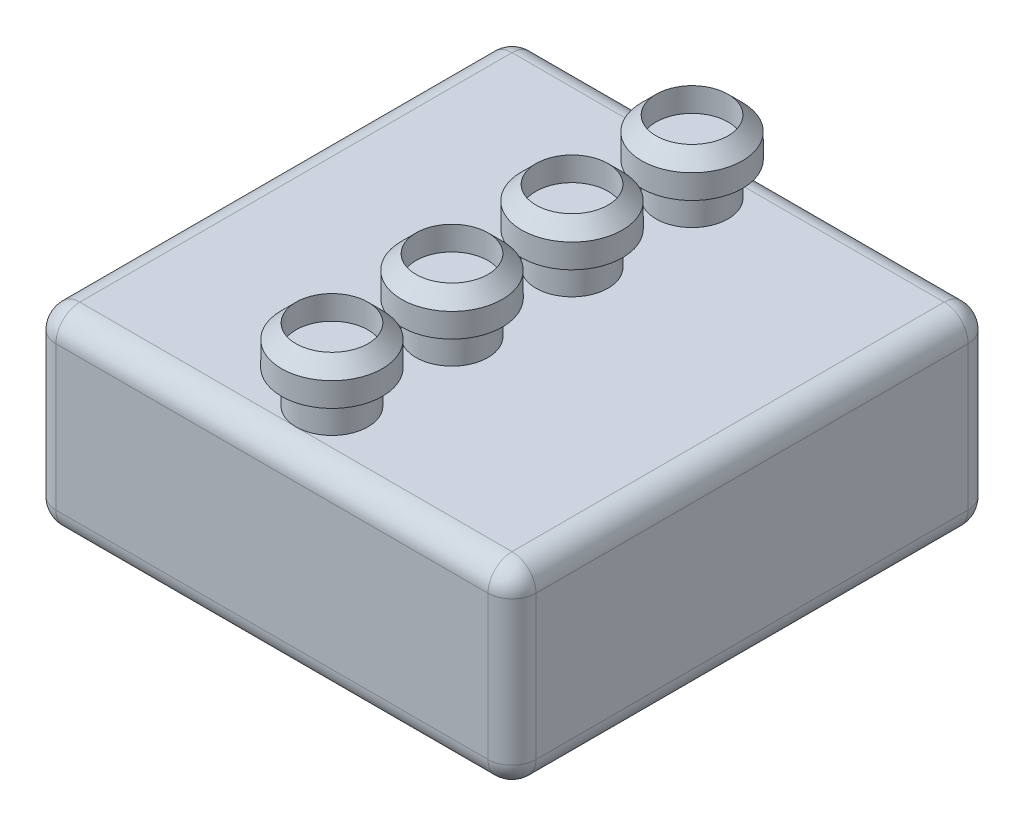
ISO-10303-21;
HEADER;
FILE_DESCRIPTION(('STEP AP214'),'2;1');
FILE_NAME('part.step','',(''),(''),'','','');
FILE_SCHEMA(('AUTOMOTIVE_DESIGN { 1 0 10303 214 1 1 1 1 }'));
ENDSEC;
DATA;
#1=APPLICATION_CONTEXT('core data for automotive mechanical design processes');
#2=APPLICATION_PROTOCOL_DEFINITION('international standard','automotive_design',2000,#1);
#3=PRODUCT_CONTEXT('',#1,'mechanical');
#4=PRODUCT('Part','Part','',(#3));
#5=PRODUCT_RELATED_PRODUCT_CATEGORY('part','',(#4));
#6=PRODUCT_DEFINITION_FORMATION('','',#4);
#7=PRODUCT_DEFINITION_CONTEXT('part definition',#1,'design');
#8=PRODUCT_DEFINITION('design','',#6,#7);
#9=PRODUCT_DEFINITION_SHAPE('','',#8);
#10=(LENGTH_UNIT() NAMED_UNIT(*) SI_UNIT(.MILLI.,.METRE.));
#11=(NAMED_UNIT(*) PLANE_ANGLE_UNIT() SI_UNIT($,.RADIAN.));
#12=(NAMED_UNIT(*) SI_UNIT($,.STERADIAN.) SOLID_ANGLE_UNIT());
#13=UNCERTAINTY_MEASURE_WITH_UNIT(LENGTH_MEASURE(1.E-05),#10,'distance_accuracy_value','');
#14=(GEOMETRIC_REPRESENTATION_CONTEXT(3) GLOBAL_UNCERTAINTY_ASSIGNED_CONTEXT((#13)) GLOBAL_UNIT_ASSIGNED_CONTEXT((#10,
#11,#12)) REPRESENTATION_CONTEXT('',''));
#15=CARTESIAN_POINT('',(0.,0.,0.));
#16=DIRECTION('',(0.,0.,1.));
#17=DIRECTION('',(1.,0.,0.));
#18=AXIS2_PLACEMENT_3D('',#15,#16,#17);
#19=CARTESIAN_POINT('',(-1.28634337458216E-13,50.,-37.5));
#20=DIRECTION('',(0.,-1.,0.));
#21=DIRECTION('',(0.,0.,-1.));
#22=AXIS2_PLACEMENT_3D('',#19,#20,#21);
#23=CYLINDRICAL_SURFACE('',#22,7.5);
#24=CARTESIAN_POINT('',(-1.28634337458216E-13,46.,-37.5));
#25=DIRECTION('',(0.,1.,0.));
#26=DIRECTION('',(0.,0.,1.));
#27=AXIS2_PLACEMENT_3D('',#24,#25,#26);
#28=CIRCLE('',#27,7.5);
#29=CARTESIAN_POINT('',(-1.28634337458216E-13,46.,-30.));
#30=VERTEX_POINT('',#29);
#31=EDGE_CURVE('E158',#30,#30,#28,.F.);
#32=ORIENTED_EDGE('',*,*,#31,.T.);
#33=EDGE_LOOP('',(#32));
#34=FACE_BOUND('',#33,.T.);
#35=CARTESIAN_POINT('',(-1.28634337458216E-13,40.,-37.5));
#36=DIRECTION('',(0.,-1.,0.));
#37=DIRECTION('',(0.,0.,-1.));
#38=AXIS2_PLACEMENT_3D('',#35,#36,#37);
#39=CIRCLE('',#38,7.5);
#40=CARTESIAN_POINT('',(-1.28634337458216E-13,40.,-45.));
#41=VERTEX_POINT('',#40);
#42=EDGE_CURVE('E140',#41,#41,#39,.F.);
#43=ORIENTED_EDGE('',*,*,#42,.T.);
#44=EDGE_LOOP('',(#43));
#45=FACE_BOUND('',#44,.T.);
#46=ADVANCED_FACE('F41',(#34,#45),#23,.T.);
#47=CARTESIAN_POINT('',(0.,50.,-12.5));
#48=DIRECTION('',(0.,-1.,0.));
#49=DIRECTION('',(0.,0.,-1.));
#50=AXIS2_PLACEMENT_3D('',#47,#48,#49);
#51=CYLINDRICAL_SURFACE('',#50,7.5);
#52=CARTESIAN_POINT('',(0.,46.,-12.5));
#53=DIRECTION('',(0.,1.,0.));
#54=DIRECTION('',(0.,0.,1.));
#55=AXIS2_PLACEMENT_3D('',#52,#53,#54);
#56=CIRCLE('',#55,7.5);
#57=CARTESIAN_POINT('',(0.,46.,-5.));
#58=VERTEX_POINT('',#57);
#59=EDGE_CURVE('E172',#58,#58,#56,.F.);
#60=ORIENTED_EDGE('',*,*,#59,.T.);
#61=EDGE_LOOP('',(#60));
#62=FACE_BOUND('',#61,.T.);
#63=CARTESIAN_POINT('',(0.,40.,-12.5));
#64=DIRECTION('',(0.,-1.,0.));
#65=DIRECTION('',(0.,0.,-1.));
#66=AXIS2_PLACEMENT_3D('',#63,#64,#65);
#67=CIRCLE('',#66,7.5);
#68=CARTESIAN_POINT('',(0.,40.,-20.));
#69=VERTEX_POINT('',#68);
#70=EDGE_CURVE('E153',#69,#69,#67,.F.);
#71=ORIENTED_EDGE('',*,*,#70,.T.);
#72=EDGE_LOOP('',(#71));
#73=FACE_BOUND('',#72,.T.);
#74=ADVANCED_FACE('F453',(#62,#73),#51,.T.);
#75=CARTESIAN_POINT('',(0.,50.,12.5));
#76=DIRECTION('',(0.,-1.,0.));
#77=DIRECTION('',(0.,0.,-1.));
#78=AXIS2_PLACEMENT_3D('',#75,#76,#77);
#79=CYLINDRICAL_SURFACE('',#78,7.5);
#80=CARTESIAN_POINT('',(0.,46.,12.5));
#81=DIRECTION('',(0.,1.,0.));
#82=DIRECTION('',(0.,0.,1.));
#83=AXIS2_PLACEMENT_3D('',#80,#81,#82);
#84=CIRCLE('',#83,7.5);
#85=CARTESIAN_POINT('',(0.,46.,20.));
#86=VERTEX_POINT('',#85);
#87=EDGE_CURVE('E180',#86,#86,#84,.F.);
#88=ORIENTED_EDGE('',*,*,#87,.T.);
#89=EDGE_LOOP('',(#88));
#90=FACE_BOUND('',#89,.T.);
#91=CARTESIAN_POINT('',(0.,40.,12.5));
#92=DIRECTION('',(0.,-1.,0.));
#93=DIRECTION('',(0.,0.,-1.));
#94=AXIS2_PLACEMENT_3D('',#91,#92,#93);
#95=CIRCLE('',#94,7.5);
#96=CARTESIAN_POINT('',(0.,40.,5.));
#97=VERTEX_POINT('',#96);
#98=EDGE_CURVE('E161',#97,#97,#95,.F.);
#99=ORIENTED_EDGE('',*,*,#98,.T.);
#100=EDGE_LOOP('',(#99));
#101=FACE_BOUND('',#100,.T.);
#102=ADVANCED_FACE('F433',(#90,#101),#79,.T.);
#103=CARTESIAN_POINT('',(1.28634337458216E-13,50.,37.5));
#104=DIRECTION('',(0.,-1.,0.));
#105=DIRECTION('',(0.,0.,-1.));
#106=AXIS2_PLACEMENT_3D('',#103,#104,#105);
#107=CYLINDRICAL_SURFACE('',#106,7.5);
#108=CARTESIAN_POINT('',(1.28634337458216E-13,46.,37.5));
#109=DIRECTION('',(0.,1.,0.));
#110=DIRECTION('',(0.,0.,1.));
#111=AXIS2_PLACEMENT_3D('',#108,#109,#110);
#112=CIRCLE('',#111,7.5);
#113=CARTESIAN_POINT('',(1.28634337458216E-13,46.,45.));
#114=VERTEX_POINT('',#113);
#115=EDGE_CURVE('E188',#114,#114,#112,.F.);
#116=ORIENTED_EDGE('',*,*,#115,.T.);
#117=EDGE_LOOP('',(#116));
#118=FACE_BOUND('',#117,.T.);
#119=CARTESIAN_POINT('',(1.28634337458216E-13,40.,37.5));
#120=DIRECTION('',(0.,-1.,0.));
#121=DIRECTION('',(0.,0.,-1.));
#122=AXIS2_PLACEMENT_3D('',#119,#120,#121);
#123=CIRCLE('',#122,7.5);
#124=CARTESIAN_POINT('',(1.28634337458216E-13,40.,45.));
#125=VERTEX_POINT('',#124);
#126=EDGE_CURVE('E426',#125,#125,#123,.F.);
#127=ORIENTED_EDGE('',*,*,#126,.T.);
#128=EDGE_LOOP('',(#127));
#129=FACE_BOUND('',#128,.T.);
#130=ADVANCED_FACE('F479',(#118,#129),#107,.T.);
#131=CARTESIAN_POINT('',(50.,40.,50.));
#132=DIRECTION('',(-1.,0.,0.));
#133=DIRECTION('',(0.,0.,1.));
#134=AXIS2_PLACEMENT_3D('',#131,#132,#133);
#135=PLANE('',#134);
#136=DIRECTION('',(0.,0.,-1.));
#137=VECTOR('',#136,1.);
#138=CARTESIAN_POINT('',(50.,35.,50.));
#139=LINE('',#138,#137);
#140=CARTESIAN_POINT('',(50.,35.,-45.));
#141=VERTEX_POINT('',#140);
#142=CARTESIAN_POINT('',(50.,35.,45.));
#143=VERTEX_POINT('',#142);
#144=EDGE_CURVE('E51',#141,#143,#139,.F.);
#145=ORIENTED_EDGE('',*,*,#144,.T.);
#146=DIRECTION('',(0.,-1.,0.));
#147=VECTOR('',#146,1.);
#148=CARTESIAN_POINT('',(50.,40.,45.));
#149=LINE('',#148,#147);
#150=CARTESIAN_POINT('',(50.,5.,45.));
#151=VERTEX_POINT('',#150);
#152=EDGE_CURVE('E11',#143,#151,#149,.T.);
#153=ORIENTED_EDGE('',*,*,#152,.T.);
#154=DIRECTION('',(0.,0.,-1.));
#155=VECTOR('',#154,1.);
#156=CARTESIAN_POINT('',(50.,5.,-50.));
#157=LINE('',#156,#155);
#158=CARTESIAN_POINT('',(50.,5.,-45.));
#159=VERTEX_POINT('',#158);
#160=EDGE_CURVE('E290',#151,#159,#157,.T.);
#161=ORIENTED_EDGE('',*,*,#160,.T.);
#162=DIRECTION('',(0.,-1.,0.));
#163=VECTOR('',#162,1.);
#164=CARTESIAN_POINT('',(50.,40.,-45.));
#165=LINE('',#164,#163);
#166=EDGE_CURVE('E62',#159,#141,#165,.F.);
#167=ORIENTED_EDGE('',*,*,#166,.T.);
#168=EDGE_LOOP('',(#145,#153,#161,#167));
#169=FACE_BOUND('',#168,.T.);
#170=ADVANCED_FACE('F487',(#169),#135,.F.);
#171=CARTESIAN_POINT('',(-50.,40.,-50.));
#172=DIRECTION('',(0.,0.,1.));
#173=DIRECTION('',(1.,0.,0.));
#174=AXIS2_PLACEMENT_3D('',#171,#172,#173);
#175=PLANE('',#174);
#176=DIRECTION('',(0.,-1.,0.));
#177=VECTOR('',#176,1.);
#178=CARTESIAN_POINT('',(-45.,40.,-50.));
#179=LINE('',#178,#177);
#180=CARTESIAN_POINT('',(-45.,5.,-50.));
#181=VERTEX_POINT('',#180);
#182=CARTESIAN_POINT('',(-45.,35.,-50.));
#183=VERTEX_POINT('',#182);
#184=EDGE_CURVE('E283',#181,#183,#179,.F.);
#185=ORIENTED_EDGE('',*,*,#184,.T.);
#186=DIRECTION('',(-1.,0.,0.));
#187=VECTOR('',#186,1.);
#188=CARTESIAN_POINT('',(-50.,35.,-50.));
#189=LINE('',#188,#187);
#190=CARTESIAN_POINT('',(45.,35.,-50.));
#191=VERTEX_POINT('',#190);
#192=EDGE_CURVE('E286',#183,#191,#189,.F.);
#193=ORIENTED_EDGE('',*,*,#192,.T.);
#194=DIRECTION('',(0.,-1.,0.));
#195=VECTOR('',#194,1.);
#196=CARTESIAN_POINT('',(45.,40.,-50.));
#197=LINE('',#196,#195);
#198=CARTESIAN_POINT('',(45.,5.,-50.));
#199=VERTEX_POINT('',#198);
#200=EDGE_CURVE('E277',#191,#199,#197,.T.);
#201=ORIENTED_EDGE('',*,*,#200,.T.);
#202=DIRECTION('',(-1.,0.,0.));
#203=VECTOR('',#202,1.);
#204=CARTESIAN_POINT('',(-50.,5.,-50.));
#205=LINE('',#204,#203);
#206=EDGE_CURVE('E280',#199,#181,#205,.T.);
#207=ORIENTED_EDGE('',*,*,#206,.T.);
#208=EDGE_LOOP('',(#185,#193,#201,#207));
#209=FACE_BOUND('',#208,.T.);
#210=ADVANCED_FACE('F492',(#209),#175,.F.);
#211=CARTESIAN_POINT('',(-50.,40.,50.));
#212=DIRECTION('',(1.,0.,0.));
#213=DIRECTION('',(0.,0.,-1.));
#214=AXIS2_PLACEMENT_3D('',#211,#212,#213);
#215=PLANE('',#214);
#216=DIRECTION('',(0.,-1.,0.));
#217=VECTOR('',#216,1.);
#218=CARTESIAN_POINT('',(-50.,40.,45.));
#219=LINE('',#218,#217);
#220=CARTESIAN_POINT('',(-50.,5.,45.));
#221=VERTEX_POINT('',#220);
#222=CARTESIAN_POINT('',(-50.,35.,45.));
#223=VERTEX_POINT('',#222);
#224=EDGE_CURVE('E270',#221,#223,#219,.F.);
#225=ORIENTED_EDGE('',*,*,#224,.T.);
#226=DIRECTION('',(0.,0.,1.));
#227=VECTOR('',#226,1.);
#228=CARTESIAN_POINT('',(-50.,35.,50.));
#229=LINE('',#228,#227);
#230=CARTESIAN_POINT('',(-50.,35.,-45.));
#231=VERTEX_POINT('',#230);
#232=EDGE_CURVE('E273',#223,#231,#229,.F.);
#233=ORIENTED_EDGE('',*,*,#232,.T.);
#234=DIRECTION('',(0.,-1.,0.));
#235=VECTOR('',#234,1.);
#236=CARTESIAN_POINT('',(-50.,40.,-45.));
#237=LINE('',#236,#235);
#238=CARTESIAN_POINT('',(-50.,5.,-45.));
#239=VERTEX_POINT('',#238);
#240=EDGE_CURVE('E264',#231,#239,#237,.T.);
#241=ORIENTED_EDGE('',*,*,#240,.T.);
#242=DIRECTION('',(0.,0.,1.));
#243=VECTOR('',#242,1.);
#244=CARTESIAN_POINT('',(-50.,5.,50.));
#245=LINE('',#244,#243);
#246=EDGE_CURVE('E267',#239,#221,#245,.T.);
#247=ORIENTED_EDGE('',*,*,#246,.T.);
#248=EDGE_LOOP('',(#225,#233,#241,#247));
#249=FACE_BOUND('',#248,.T.);
#250=ADVANCED_FACE('F447',(#249),#215,.F.);
#251=CARTESIAN_POINT('',(-50.,40.,50.));
#252=DIRECTION('',(0.,0.,-1.));
#253=DIRECTION('',(-1.,0.,0.));
#254=AXIS2_PLACEMENT_3D('',#251,#252,#253);
#255=PLANE('',#254);
#256=DIRECTION('',(1.,0.,0.));
#257=VECTOR('',#256,1.);
#258=CARTESIAN_POINT('',(-50.,35.,50.));
#259=LINE('',#258,#257);
#260=CARTESIAN_POINT('',(45.,35.,50.));
#261=VERTEX_POINT('',#260);
#262=CARTESIAN_POINT('',(-45.,35.,50.));
#263=VERTEX_POINT('',#262);
#264=EDGE_CURVE('E244',#261,#263,#259,.F.);
#265=ORIENTED_EDGE('',*,*,#264,.T.);
#266=DIRECTION('',(0.,-1.,0.));
#267=VECTOR('',#266,1.);
#268=CARTESIAN_POINT('',(-45.,40.,50.));
#269=LINE('',#268,#267);
#270=CARTESIAN_POINT('',(-45.,5.,50.));
#271=VERTEX_POINT('',#270);
#272=EDGE_CURVE('E248',#263,#271,#269,.T.);
#273=ORIENTED_EDGE('',*,*,#272,.T.);
#274=DIRECTION('',(1.,0.,0.));
#275=VECTOR('',#274,1.);
#276=CARTESIAN_POINT('',(50.,5.,50.));
#277=LINE('',#276,#275);
#278=CARTESIAN_POINT('',(45.,5.,50.));
#279=VERTEX_POINT('',#278);
#280=EDGE_CURVE('E241',#271,#279,#277,.T.);
#281=ORIENTED_EDGE('',*,*,#280,.T.);
#282=DIRECTION('',(0.,-1.,0.));
#283=VECTOR('',#282,1.);
#284=CARTESIAN_POINT('',(45.,40.,50.));
#285=LINE('',#284,#283);
#286=EDGE_CURVE('E238',#279,#261,#285,.F.);
#287=ORIENTED_EDGE('',*,*,#286,.T.);
#288=EDGE_LOOP('',(#265,#273,#281,#287));
#289=FACE_BOUND('',#288,.T.);
#290=ADVANCED_FACE('F437',(#289),#255,.F.);
#291=CARTESIAN_POINT('',(0.,40.,0.));
#292=DIRECTION('',(0.,-1.,0.));
#293=DIRECTION('',(0.,0.,-1.));
#294=AXIS2_PLACEMENT_3D('',#291,#292,#293);
#295=PLANE('',#294);
#296=ORIENTED_EDGE('',*,*,#70,.F.);
#297=EDGE_LOOP('',(#296));
#298=FACE_BOUND('',#297,.T.);
#299=ORIENTED_EDGE('',*,*,#98,.F.);
#300=EDGE_LOOP('',(#299));
#301=FACE_BOUND('',#300,.T.);
#302=DIRECTION('',(-1.,0.,0.));
#303=VECTOR('',#302,1.);
#304=CARTESIAN_POINT('',(0.,40.,-45.));
#305=LINE('',#304,#303);
#306=CARTESIAN_POINT('',(-45.,40.,-45.));
#307=VERTEX_POINT('',#306);
#308=EDGE_CURVE('E232',#41,#307,#305,.T.);
#309=ORIENTED_EDGE('',*,*,#308,.T.);
#310=DIRECTION('',(0.,0.,1.));
#311=VECTOR('',#310,1.);
#312=CARTESIAN_POINT('',(-45.,40.,0.));
#313=LINE('',#312,#311);
#314=CARTESIAN_POINT('',(-45.,40.,45.));
#315=VERTEX_POINT('',#314);
#316=EDGE_CURVE('E235',#307,#315,#313,.T.);
#317=ORIENTED_EDGE('',*,*,#316,.T.);
#318=DIRECTION('',(1.,0.,0.));
#319=VECTOR('',#318,1.);
#320=CARTESIAN_POINT('',(0.,40.,45.));
#321=LINE('',#320,#319);
#322=EDGE_CURVE('E228',#315,#125,#321,.T.);
#323=ORIENTED_EDGE('',*,*,#322,.T.);
#324=ORIENTED_EDGE('',*,*,#126,.F.);
#325=DIRECTION('',(1.,0.,0.));
#326=VECTOR('',#325,1.);
#327=CARTESIAN_POINT('',(0.,40.,45.));
#328=LINE('',#327,#326);
#329=CARTESIAN_POINT('',(45.,40.,45.));
#330=VERTEX_POINT('',#329);
#331=EDGE_CURVE('E148',#125,#330,#328,.T.);
#332=ORIENTED_EDGE('',*,*,#331,.T.);
#333=DIRECTION('',(0.,0.,-1.));
#334=VECTOR('',#333,1.);
#335=CARTESIAN_POINT('',(45.,40.,0.));
#336=LINE('',#335,#334);
#337=CARTESIAN_POINT('',(45.,40.,-45.));
#338=VERTEX_POINT('',#337);
#339=EDGE_CURVE('E143',#330,#338,#336,.T.);
#340=ORIENTED_EDGE('',*,*,#339,.T.);
#341=DIRECTION('',(-1.,0.,0.));
#342=VECTOR('',#341,1.);
#343=CARTESIAN_POINT('',(0.,40.,-45.));
#344=LINE('',#343,#342);
#345=EDGE_CURVE('E137',#338,#41,#344,.T.);
#346=ORIENTED_EDGE('',*,*,#345,.T.);
#347=ORIENTED_EDGE('',*,*,#42,.F.);
#348=EDGE_LOOP('',(#309,#317,#323,#324,#332,#340,#346,#347));
#349=FACE_BOUND('',#348,.T.);
#350=ADVANCED_FACE('F139',(#298,#301,#349),#295,.F.);
#351=CARTESIAN_POINT('',(0.,0.,0.));
#352=DIRECTION('',(0.,-1.,0.));
#353=DIRECTION('',(0.,0.,-1.));
#354=AXIS2_PLACEMENT_3D('',#351,#352,#353);
#355=PLANE('',#354);
#356=DIRECTION('',(0.,0.,-1.));
#357=VECTOR('',#356,1.);
#358=CARTESIAN_POINT('',(45.,0.,50.));
#359=LINE('',#358,#357);
#360=CARTESIAN_POINT('',(45.,0.,-45.));
#361=VERTEX_POINT('',#360);
#362=CARTESIAN_POINT('',(45.,0.,45.));
#363=VERTEX_POINT('',#362);
#364=EDGE_CURVE('E251',#361,#363,#359,.F.);
#365=ORIENTED_EDGE('',*,*,#364,.T.);
#366=DIRECTION('',(1.,0.,0.));
#367=VECTOR('',#366,1.);
#368=CARTESIAN_POINT('',(-50.,0.,45.));
#369=LINE('',#368,#367);
#370=CARTESIAN_POINT('',(-45.,0.,45.));
#371=VERTEX_POINT('',#370);
#372=EDGE_CURVE('E260',#363,#371,#369,.F.);
#373=ORIENTED_EDGE('',*,*,#372,.T.);
#374=DIRECTION('',(0.,0.,1.));
#375=VECTOR('',#374,1.);
#376=CARTESIAN_POINT('',(-45.,0.,-50.));
#377=LINE('',#376,#375);
#378=CARTESIAN_POINT('',(-45.,0.,-45.));
#379=VERTEX_POINT('',#378);
#380=EDGE_CURVE('E257',#371,#379,#377,.F.);
#381=ORIENTED_EDGE('',*,*,#380,.T.);
#382=DIRECTION('',(-1.,0.,0.));
#383=VECTOR('',#382,1.);
#384=CARTESIAN_POINT('',(50.,0.,-45.));
#385=LINE('',#384,#383);
#386=EDGE_CURVE('E254',#379,#361,#385,.F.);
#387=ORIENTED_EDGE('',*,*,#386,.T.);
#388=EDGE_LOOP('',(#365,#373,#381,#387));
#389=FACE_BOUND('',#388,.T.);
#390=ADVANCED_FACE('F436',(#389),#355,.T.);
#391=CARTESIAN_POINT('',(1.28634337458216E-13,47.,37.5));
#392=DIRECTION('',(0.,1.,0.));
#393=DIRECTION('',(0.,0.,1.));
#394=AXIS2_PLACEMENT_3D('',#391,#392,#393);
#395=PLANE('',#394);
#396=CARTESIAN_POINT('',(1.28634337458216E-13,47.,37.5));
#397=DIRECTION('',(0.,1.,0.));
#398=DIRECTION('',(0.,0.,1.));
#399=AXIS2_PLACEMENT_3D('',#396,#397,#398);
#400=CIRCLE('',#399,8.49999999999999);
#401=CARTESIAN_POINT('',(1.28634337458216E-13,47.,46.));
#402=VERTEX_POINT('',#401);
#403=EDGE_CURVE('E184',#402,#402,#400,.T.);
#404=ORIENTED_EDGE('',*,*,#403,.T.);
#405=EDGE_LOOP('',(#404));
#406=FACE_BOUND('',#405,.T.);
#407=CARTESIAN_POINT('',(1.28634337458216E-13,47.,37.5));
#408=DIRECTION('',(0.,1.,0.));
#409=DIRECTION('',(0.,0.,1.));
#410=AXIS2_PLACEMENT_3D('',#407,#408,#409);
#411=CIRCLE('',#410,10.5);
#412=CARTESIAN_POINT('',(1.28634337458216E-13,47.,48.));
#413=VERTEX_POINT('',#412);
#414=EDGE_CURVE('E418',#413,#413,#411,.T.);
#415=ORIENTED_EDGE('',*,*,#414,.F.);
#416=EDGE_LOOP('',(#415));
#417=FACE_BOUND('',#416,.T.);
#418=ADVANCED_FACE('F444',(#406,#417),#395,.F.);
#419=CARTESIAN_POINT('',(1.28634337458216E-13,57.,37.5));
#420=DIRECTION('',(0.,-1.,0.));
#421=DIRECTION('',(0.,0.,-1.));
#422=AXIS2_PLACEMENT_3D('',#419,#420,#421);
#423=CYLINDRICAL_SURFACE('',#422,10.5);
#424=CARTESIAN_POINT('',(1.28634337458216E-13,52.,37.5));
#425=DIRECTION('',(0.,1.,0.));
#426=DIRECTION('',(0.,0.,1.));
#427=AXIS2_PLACEMENT_3D('',#424,#425,#426);
#428=CIRCLE('',#427,10.5);
#429=CARTESIAN_POINT('',(1.28634337458216E-13,52.,48.));
#430=VERTEX_POINT('',#429);
#431=EDGE_CURVE('E220',#430,#430,#428,.F.);
#432=ORIENTED_EDGE('',*,*,#431,.T.);
#433=EDGE_LOOP('',(#432));
#434=FACE_BOUND('',#433,.T.);
#435=ORIENTED_EDGE('',*,*,#414,.T.);
#436=EDGE_LOOP('',(#435));
#437=FACE_BOUND('',#436,.T.);
#438=ADVANCED_FACE('F916',(#434,#437),#423,.T.);
#439=CARTESIAN_POINT('',(1.28634337458216E-13,57.,37.5));
#440=DIRECTION('',(0.,-1.,0.));
#441=DIRECTION('',(0.,0.,-1.));
#442=AXIS2_PLACEMENT_3D('',#439,#440,#441);
#443=CYLINDRICAL_SURFACE('',#442,7.5);
#444=CARTESIAN_POINT('',(1.28634337458216E-13,54.9999999999999,37.5));
#445=DIRECTION('',(0.,-1.,0.));
#446=DIRECTION('',(0.,0.,-1.));
#447=AXIS2_PLACEMENT_3D('',#444,#445,#446);
#448=CIRCLE('',#447,7.5);
#449=CARTESIAN_POINT('',(1.28634337458216E-13,54.9999999999999,30.));
#450=VERTEX_POINT('',#449);
#451=EDGE_CURVE('E216',#450,#450,#448,.F.);
#452=ORIENTED_EDGE('',*,*,#451,.T.);
#453=EDGE_LOOP('',(#452));
#454=FACE_BOUND('',#453,.T.);
#455=CARTESIAN_POINT('',(1.28634337458216E-13,50.,37.5));
#456=DIRECTION('',(0.,1.,0.));
#457=DIRECTION('',(0.,0.,1.));
#458=AXIS2_PLACEMENT_3D('',#455,#456,#457);
#459=CIRCLE('',#458,7.5);
#460=CARTESIAN_POINT('',(1.28634337458216E-13,50.,45.));
#461=VERTEX_POINT('',#460);
#462=EDGE_CURVE('E422',#461,#461,#459,.F.);
#463=ORIENTED_EDGE('',*,*,#462,.T.);
#464=EDGE_LOOP('',(#463));
#465=FACE_BOUND('',#464,.T.);
#466=ADVANCED_FACE('F484',(#454,#465),#443,.F.);
#467=CARTESIAN_POINT('',(0.,50.,0.));
#468=DIRECTION('',(0.,1.,0.));
#469=DIRECTION('',(0.,0.,1.));
#470=AXIS2_PLACEMENT_3D('',#467,#468,#469);
#471=PLANE('',#470);
#472=ORIENTED_EDGE('',*,*,#462,.F.);
#473=EDGE_LOOP('',(#472));
#474=FACE_BOUND('',#473,.T.);
#475=ADVANCED_FACE('F481',(#474),#471,.T.);
#476=CARTESIAN_POINT('',(0.,47.,12.5));
#477=DIRECTION('',(0.,1.,0.));
#478=DIRECTION('',(0.,0.,1.));
#479=AXIS2_PLACEMENT_3D('',#476,#477,#478);
#480=PLANE('',#479);
#481=CARTESIAN_POINT('',(0.,47.,12.5));
#482=DIRECTION('',(0.,1.,0.));
#483=DIRECTION('',(0.,0.,1.));
#484=AXIS2_PLACEMENT_3D('',#481,#482,#483);
#485=CIRCLE('',#484,8.49999999999999);
#486=CARTESIAN_POINT('',(0.,47.,21.));
#487=VERTEX_POINT('',#486);
#488=EDGE_CURVE('E176',#487,#487,#485,.T.);
#489=ORIENTED_EDGE('',*,*,#488,.T.);
#490=EDGE_LOOP('',(#489));
#491=FACE_BOUND('',#490,.T.);
#492=CARTESIAN_POINT('',(0.,47.,12.5));
#493=DIRECTION('',(0.,1.,0.));
#494=DIRECTION('',(0.,0.,1.));
#495=AXIS2_PLACEMENT_3D('',#492,#493,#494);
#496=CIRCLE('',#495,10.5);
#497=CARTESIAN_POINT('',(0.,47.,23.));
#498=VERTEX_POINT('',#497);
#499=EDGE_CURVE('E410',#498,#498,#496,.T.);
#500=ORIENTED_EDGE('',*,*,#499,.F.);
#501=EDGE_LOOP('',(#500));
#502=FACE_BOUND('',#501,.T.);
#503=ADVANCED_FACE('F483',(#491,#502),#480,.F.);
#504=CARTESIAN_POINT('',(0.,57.,12.5));
#505=DIRECTION('',(0.,-1.,0.));
#506=DIRECTION('',(0.,0.,-1.));
#507=AXIS2_PLACEMENT_3D('',#504,#505,#506);
#508=CYLINDRICAL_SURFACE('',#507,10.5);
#509=CARTESIAN_POINT('',(0.,52.,12.5));
#510=DIRECTION('',(0.,1.,0.));
#511=DIRECTION('',(0.,0.,1.));
#512=AXIS2_PLACEMENT_3D('',#509,#510,#511);
#513=CIRCLE('',#512,10.5);
#514=CARTESIAN_POINT('',(0.,52.,23.));
#515=VERTEX_POINT('',#514);
#516=EDGE_CURVE('E212',#515,#515,#513,.F.);
#517=ORIENTED_EDGE('',*,*,#516,.T.);
#518=EDGE_LOOP('',(#517));
#519=FACE_BOUND('',#518,.T.);
#520=ORIENTED_EDGE('',*,*,#499,.T.);
#521=EDGE_LOOP('',(#520));
#522=FACE_BOUND('',#521,.T.);
#523=ADVANCED_FACE('F891',(#519,#522),#508,.T.);
#524=CARTESIAN_POINT('',(0.,57.,12.5));
#525=DIRECTION('',(0.,-1.,0.));
#526=DIRECTION('',(0.,0.,-1.));
#527=AXIS2_PLACEMENT_3D('',#524,#525,#526);
#528=CYLINDRICAL_SURFACE('',#527,7.5);
#529=CARTESIAN_POINT('',(0.,54.9999999999999,12.5));
#530=DIRECTION('',(0.,-1.,0.));
#531=DIRECTION('',(0.,0.,-1.));
#532=AXIS2_PLACEMENT_3D('',#529,#530,#531);
#533=CIRCLE('',#532,7.5);
#534=CARTESIAN_POINT('',(0.,54.9999999999999,5.));
#535=VERTEX_POINT('',#534);
#536=EDGE_CURVE('E208',#535,#535,#533,.F.);
#537=ORIENTED_EDGE('',*,*,#536,.T.);
#538=EDGE_LOOP('',(#537));
#539=FACE_BOUND('',#538,.T.);
#540=CARTESIAN_POINT('',(0.,50.,12.5));
#541=DIRECTION('',(0.,1.,0.));
#542=DIRECTION('',(0.,0.,1.));
#543=AXIS2_PLACEMENT_3D('',#540,#541,#542);
#544=CIRCLE('',#543,7.5);
#545=CARTESIAN_POINT('',(0.,50.,20.));
#546=VERTEX_POINT('',#545);
#547=EDGE_CURVE('E414',#546,#546,#544,.F.);
#548=ORIENTED_EDGE('',*,*,#547,.T.);
#549=EDGE_LOOP('',(#548));
#550=FACE_BOUND('',#549,.T.);
#551=ADVANCED_FACE('F475',(#539,#550),#528,.F.);
#552=CARTESIAN_POINT('',(0.,50.,0.));
#553=DIRECTION('',(0.,1.,0.));
#554=DIRECTION('',(0.,0.,1.));
#555=AXIS2_PLACEMENT_3D('',#552,#553,#554);
#556=PLANE('',#555);
#557=ORIENTED_EDGE('',*,*,#547,.F.);
#558=EDGE_LOOP('',(#557));
#559=FACE_BOUND('',#558,.T.);
#560=ADVANCED_FACE('F471',(#559),#556,.T.);
#561=CARTESIAN_POINT('',(0.,47.,-12.5));
#562=DIRECTION('',(0.,1.,0.));
#563=DIRECTION('',(0.,0.,1.));
#564=AXIS2_PLACEMENT_3D('',#561,#562,#563);
#565=PLANE('',#564);
#566=CARTESIAN_POINT('',(0.,47.,-12.5));
#567=DIRECTION('',(0.,1.,0.));
#568=DIRECTION('',(0.,0.,1.));
#569=AXIS2_PLACEMENT_3D('',#566,#567,#568);
#570=CIRCLE('',#569,8.49999999999999);
#571=CARTESIAN_POINT('',(0.,47.,-4.00000000000001));
#572=VERTEX_POINT('',#571);
#573=EDGE_CURVE('E168',#572,#572,#570,.T.);
#574=ORIENTED_EDGE('',*,*,#573,.T.);
#575=EDGE_LOOP('',(#574));
#576=FACE_BOUND('',#575,.T.);
#577=CARTESIAN_POINT('',(0.,47.,-12.5));
#578=DIRECTION('',(0.,1.,0.));
#579=DIRECTION('',(0.,0.,1.));
#580=AXIS2_PLACEMENT_3D('',#577,#578,#579);
#581=CIRCLE('',#580,10.5);
#582=CARTESIAN_POINT('',(0.,47.,-2.));
#583=VERTEX_POINT('',#582);
#584=EDGE_CURVE('E400',#583,#583,#581,.T.);
#585=ORIENTED_EDGE('',*,*,#584,.F.);
#586=EDGE_LOOP('',(#585));
#587=FACE_BOUND('',#586,.T.);
#588=ADVANCED_FACE('F474',(#576,#587),#565,.F.);
#589=CARTESIAN_POINT('',(0.,57.,-12.5));
#590=DIRECTION('',(0.,-1.,0.));
#591=DIRECTION('',(0.,0.,-1.));
#592=AXIS2_PLACEMENT_3D('',#589,#590,#591);
#593=CYLINDRICAL_SURFACE('',#592,10.5);
#594=CARTESIAN_POINT('',(0.,52.,-12.5));
#595=DIRECTION('',(0.,1.,0.));
#596=DIRECTION('',(0.,0.,1.));
#597=AXIS2_PLACEMENT_3D('',#594,#595,#596);
#598=CIRCLE('',#597,10.5);
#599=CARTESIAN_POINT('',(0.,52.,-2.));
#600=VERTEX_POINT('',#599);
#601=EDGE_CURVE('E204',#600,#600,#598,.F.);
#602=ORIENTED_EDGE('',*,*,#601,.T.);
#603=EDGE_LOOP('',(#602));
#604=FACE_BOUND('',#603,.T.);
#605=ORIENTED_EDGE('',*,*,#584,.T.);
#606=EDGE_LOOP('',(#605));
#607=FACE_BOUND('',#606,.T.);
#608=ADVANCED_FACE('F866',(#604,#607),#593,.T.);
#609=CARTESIAN_POINT('',(0.,57.,-12.5));
#610=DIRECTION('',(0.,-1.,0.));
#611=DIRECTION('',(0.,0.,-1.));
#612=AXIS2_PLACEMENT_3D('',#609,#610,#611);
#613=CYLINDRICAL_SURFACE('',#612,7.5);
#614=CARTESIAN_POINT('',(0.,54.9999999999999,-12.5));
#615=DIRECTION('',(0.,-1.,0.));
#616=DIRECTION('',(0.,0.,-1.));
#617=AXIS2_PLACEMENT_3D('',#614,#615,#616);
#618=CIRCLE('',#617,7.5);
#619=CARTESIAN_POINT('',(0.,54.9999999999999,-20.));
#620=VERTEX_POINT('',#619);
#621=EDGE_CURVE('E200',#620,#620,#618,.F.);
#622=ORIENTED_EDGE('',*,*,#621,.T.);
#623=EDGE_LOOP('',(#622));
#624=FACE_BOUND('',#623,.T.);
#625=CARTESIAN_POINT('',(0.,50.,-12.5));
#626=DIRECTION('',(0.,1.,0.));
#627=DIRECTION('',(0.,0.,1.));
#628=AXIS2_PLACEMENT_3D('',#625,#626,#627);
#629=CIRCLE('',#628,7.5);
#630=CARTESIAN_POINT('',(0.,50.,-5.));
#631=VERTEX_POINT('',#630);
#632=EDGE_CURVE('E406',#631,#631,#629,.F.);
#633=ORIENTED_EDGE('',*,*,#632,.T.);
#634=EDGE_LOOP('',(#633));
#635=FACE_BOUND('',#634,.T.);
#636=ADVANCED_FACE('F468',(#624,#635),#613,.F.);
#637=CARTESIAN_POINT('',(0.,50.,0.));
#638=DIRECTION('',(0.,1.,0.));
#639=DIRECTION('',(0.,0.,1.));
#640=AXIS2_PLACEMENT_3D('',#637,#638,#639);
#641=PLANE('',#640);
#642=ORIENTED_EDGE('',*,*,#632,.F.);
#643=EDGE_LOOP('',(#642));
#644=FACE_BOUND('',#643,.T.);
#645=ADVANCED_FACE('F465',(#644),#641,.T.);
#646=CARTESIAN_POINT('',(-1.28634337458216E-13,47.,-37.5));
#647=DIRECTION('',(0.,1.,0.));
#648=DIRECTION('',(0.,0.,1.));
#649=AXIS2_PLACEMENT_3D('',#646,#647,#648);
#650=PLANE('',#649);
#651=CARTESIAN_POINT('',(-1.28634337458216E-13,47.,-37.5));
#652=DIRECTION('',(0.,1.,0.));
#653=DIRECTION('',(0.,0.,1.));
#654=AXIS2_PLACEMENT_3D('',#651,#652,#653);
#655=CIRCLE('',#654,8.49999999999997);
#656=CARTESIAN_POINT('',(-1.28634337458216E-13,47.,-29.));
#657=VERTEX_POINT('',#656);
#658=EDGE_CURVE('E152',#657,#657,#655,.T.);
#659=ORIENTED_EDGE('',*,*,#658,.T.);
#660=EDGE_LOOP('',(#659));
#661=FACE_BOUND('',#660,.T.);
#662=CARTESIAN_POINT('',(-1.28634337458216E-13,47.,-37.5));
#663=DIRECTION('',(0.,1.,0.));
#664=DIRECTION('',(0.,0.,1.));
#665=AXIS2_PLACEMENT_3D('',#662,#663,#664);
#666=CIRCLE('',#665,10.5);
#667=CARTESIAN_POINT('',(-1.28634337458216E-13,47.,-27.));
#668=VERTEX_POINT('',#667);
#669=EDGE_CURVE('E387',#668,#668,#666,.T.);
#670=ORIENTED_EDGE('',*,*,#669,.F.);
#671=EDGE_LOOP('',(#670));
#672=FACE_BOUND('',#671,.T.);
#673=ADVANCED_FACE('F467',(#661,#672),#650,.F.);
#674=CARTESIAN_POINT('',(-1.28634337458216E-13,57.,-37.5));
#675=DIRECTION('',(0.,-1.,0.));
#676=DIRECTION('',(0.,0.,-1.));
#677=AXIS2_PLACEMENT_3D('',#674,#675,#676);
#678=CYLINDRICAL_SURFACE('',#677,10.5);
#679=CARTESIAN_POINT('',(-1.28634337458216E-13,52.,-37.5));
#680=DIRECTION('',(0.,1.,0.));
#681=DIRECTION('',(0.,0.,1.));
#682=AXIS2_PLACEMENT_3D('',#679,#680,#681);
#683=CIRCLE('',#682,10.5);
#684=CARTESIAN_POINT('',(-1.28634337458216E-13,52.,-27.));
#685=VERTEX_POINT('',#684);
#686=EDGE_CURVE('E196',#685,#685,#683,.F.);
#687=ORIENTED_EDGE('',*,*,#686,.T.);
#688=EDGE_LOOP('',(#687));
#689=FACE_BOUND('',#688,.T.);
#690=ORIENTED_EDGE('',*,*,#669,.T.);
#691=EDGE_LOOP('',(#690));
#692=FACE_BOUND('',#691,.T.);
#693=ADVANCED_FACE('F841',(#689,#692),#678,.T.);
#694=CARTESIAN_POINT('',(-1.28634337458216E-13,57.,-37.5));
#695=DIRECTION('',(0.,-1.,0.));
#696=DIRECTION('',(0.,0.,-1.));
#697=AXIS2_PLACEMENT_3D('',#694,#695,#696);
#698=CYLINDRICAL_SURFACE('',#697,7.5);
#699=CARTESIAN_POINT('',(-1.28634337458216E-13,54.9999999999999,-37.5));
#700=DIRECTION('',(0.,-1.,0.));
#701=DIRECTION('',(0.,0.,-1.));
#702=AXIS2_PLACEMENT_3D('',#699,#700,#701);
#703=CIRCLE('',#702,7.5);
#704=CARTESIAN_POINT('',(-1.28634337458216E-13,54.9999999999999,-45.));
#705=VERTEX_POINT('',#704);
#706=EDGE_CURVE('E192',#705,#705,#703,.F.);
#707=ORIENTED_EDGE('',*,*,#706,.T.);
#708=EDGE_LOOP('',(#707));
#709=FACE_BOUND('',#708,.T.);
#710=CARTESIAN_POINT('',(-1.28634337458216E-13,50.,-37.5));
#711=DIRECTION('',(0.,1.,0.));
#712=DIRECTION('',(0.,0.,1.));
#713=AXIS2_PLACEMENT_3D('',#710,#711,#712);
#714=CIRCLE('',#713,7.5);
#715=CARTESIAN_POINT('',(-1.28634337458216E-13,50.,-30.));
#716=VERTEX_POINT('',#715);
#717=EDGE_CURVE('E394',#716,#716,#714,.F.);
#718=ORIENTED_EDGE('',*,*,#717,.T.);
#719=EDGE_LOOP('',(#718));
#720=FACE_BOUND('',#719,.T.);
#721=ADVANCED_FACE('F836',(#709,#720),#698,.F.);
#722=CARTESIAN_POINT('',(0.,50.,0.));
#723=DIRECTION('',(0.,1.,0.));
#724=DIRECTION('',(0.,0.,1.));
#725=AXIS2_PLACEMENT_3D('',#722,#723,#724);
#726=PLANE('',#725);
#727=ORIENTED_EDGE('',*,*,#717,.F.);
#728=EDGE_LOOP('',(#727));
#729=FACE_BOUND('',#728,.T.);
#730=ADVANCED_FACE('F463',(#729),#726,.T.);
#731=CARTESIAN_POINT('',(-1.28634337458216E-13,47.,-37.5));
#732=DIRECTION('',(0.,1.,0.));
#733=DIRECTION('',(0.,0.,1.));
#734=AXIS2_PLACEMENT_3D('',#731,#732,#733);
#735=CONICAL_SURFACE('',#734,8.49999999999997,0.785398163397438);
#736=ORIENTED_EDGE('',*,*,#31,.F.);
#737=EDGE_LOOP('',(#736));
#738=FACE_BOUND('',#737,.T.);
#739=ORIENTED_EDGE('',*,*,#658,.F.);
#740=EDGE_LOOP('',(#739));
#741=FACE_BOUND('',#740,.T.);
#742=ADVANCED_FACE('F651',(#738,#741),#735,.T.);
#743=CARTESIAN_POINT('',(0.,47.,-12.5));
#744=DIRECTION('',(0.,1.,0.));
#745=DIRECTION('',(0.,0.,1.));
#746=AXIS2_PLACEMENT_3D('',#743,#744,#745);
#747=CONICAL_SURFACE('',#746,8.49999999999999,0.785398163397459);
#748=ORIENTED_EDGE('',*,*,#59,.F.);
#749=EDGE_LOOP('',(#748));
#750=FACE_BOUND('',#749,.T.);
#751=ORIENTED_EDGE('',*,*,#573,.F.);
#752=EDGE_LOOP('',(#751));
#753=FACE_BOUND('',#752,.T.);
#754=ADVANCED_FACE('F644',(#750,#753),#747,.T.);
#755=CARTESIAN_POINT('',(0.,47.,12.5));
#756=DIRECTION('',(0.,1.,0.));
#757=DIRECTION('',(0.,0.,1.));
#758=AXIS2_PLACEMENT_3D('',#755,#756,#757);
#759=CONICAL_SURFACE('',#758,8.49999999999999,0.785398163397459);
#760=ORIENTED_EDGE('',*,*,#87,.F.);
#761=EDGE_LOOP('',(#760));
#762=FACE_BOUND('',#761,.T.);
#763=ORIENTED_EDGE('',*,*,#488,.F.);
#764=EDGE_LOOP('',(#763));
#765=FACE_BOUND('',#764,.T.);
#766=ADVANCED_FACE('F637',(#762,#765),#759,.T.);
#767=CARTESIAN_POINT('',(1.28634337458216E-13,47.,37.5));
#768=DIRECTION('',(0.,1.,0.));
#769=DIRECTION('',(0.,0.,1.));
#770=AXIS2_PLACEMENT_3D('',#767,#768,#769);
#771=CONICAL_SURFACE('',#770,8.49999999999999,0.785398163397459);
#772=ORIENTED_EDGE('',*,*,#115,.F.);
#773=EDGE_LOOP('',(#772));
#774=FACE_BOUND('',#773,.T.);
#775=ORIENTED_EDGE('',*,*,#403,.F.);
#776=EDGE_LOOP('',(#775));
#777=FACE_BOUND('',#776,.T.);
#778=ADVANCED_FACE('F630',(#774,#777),#771,.T.);
#779=CARTESIAN_POINT('',(-1.28634337458216E-13,57.,-37.5));
#780=DIRECTION('',(0.,-1.,0.));
#781=DIRECTION('',(0.,0.,-1.));
#782=AXIS2_PLACEMENT_3D('',#779,#780,#781);
#783=CONICAL_SURFACE('',#782,5.49999999999991,0.785398163397454);
#784=ORIENTED_EDGE('',*,*,#686,.F.);
#785=EDGE_LOOP('',(#784));
#786=FACE_BOUND('',#785,.T.);
#787=ORIENTED_EDGE('',*,*,#706,.F.);
#788=EDGE_LOOP('',(#787));
#789=FACE_BOUND('',#788,.T.);
#790=ADVANCED_FACE('F623',(#786,#789),#783,.T.);
#791=CARTESIAN_POINT('',(0.,57.,-12.5));
#792=DIRECTION('',(0.,-1.,0.));
#793=DIRECTION('',(0.,0.,-1.));
#794=AXIS2_PLACEMENT_3D('',#791,#792,#793);
#795=CONICAL_SURFACE('',#794,5.49999999999991,0.785398163397454);
#796=ORIENTED_EDGE('',*,*,#601,.F.);
#797=EDGE_LOOP('',(#796));
#798=FACE_BOUND('',#797,.T.);
#799=ORIENTED_EDGE('',*,*,#621,.F.);
#800=EDGE_LOOP('',(#799));
#801=FACE_BOUND('',#800,.T.);
#802=ADVANCED_FACE('F616',(#798,#801),#795,.T.);
#803=CARTESIAN_POINT('',(0.,57.,12.5));
#804=DIRECTION('',(0.,-1.,0.));
#805=DIRECTION('',(0.,0.,-1.));
#806=AXIS2_PLACEMENT_3D('',#803,#804,#805);
#807=CONICAL_SURFACE('',#806,5.49999999999991,0.785398163397454);
#808=ORIENTED_EDGE('',*,*,#516,.F.);
#809=EDGE_LOOP('',(#808));
#810=FACE_BOUND('',#809,.T.);
#811=ORIENTED_EDGE('',*,*,#536,.F.);
#812=EDGE_LOOP('',(#811));
#813=FACE_BOUND('',#812,.T.);
#814=ADVANCED_FACE('F609',(#810,#813),#807,.T.);
#815=CARTESIAN_POINT('',(1.28634337458216E-13,57.,37.5));
#816=DIRECTION('',(0.,-1.,0.));
#817=DIRECTION('',(0.,0.,-1.));
#818=AXIS2_PLACEMENT_3D('',#815,#816,#817);
#819=CONICAL_SURFACE('',#818,5.49999999999991,0.785398163397454);
#820=ORIENTED_EDGE('',*,*,#431,.F.);
#821=EDGE_LOOP('',(#820));
#822=FACE_BOUND('',#821,.T.);
#823=ORIENTED_EDGE('',*,*,#451,.F.);
#824=EDGE_LOOP('',(#823));
#825=FACE_BOUND('',#824,.T.);
#826=ADVANCED_FACE('F603',(#822,#825),#819,.T.);
#827=CARTESIAN_POINT('',(-50.,5.,-45.));
#828=DIRECTION('',(1.,0.,0.));
#829=DIRECTION('',(0.,0.,-1.));
#830=AXIS2_PLACEMENT_3D('',#827,#828,#829);
#831=CYLINDRICAL_SURFACE('',#830,5.);
#832=CARTESIAN_POINT('',(-45.,5.,-45.));
#833=DIRECTION('',(-1.,0.,0.));
#834=DIRECTION('',(0.,0.,1.));
#835=AXIS2_PLACEMENT_3D('',#832,#833,#834);
#836=CIRCLE('',#835,5.);
#837=EDGE_CURVE('E45',#181,#379,#836,.T.);
#838=ORIENTED_EDGE('',*,*,#837,.F.);
#839=ORIENTED_EDGE('',*,*,#206,.F.);
#840=CARTESIAN_POINT('',(45.,5.,-45.));
#841=DIRECTION('',(1.,0.,0.));
#842=DIRECTION('',(0.,0.,-1.));
#843=AXIS2_PLACEMENT_3D('',#840,#841,#842);
#844=CIRCLE('',#843,5.);
#845=EDGE_CURVE('E378',#361,#199,#844,.T.);
#846=ORIENTED_EDGE('',*,*,#845,.F.);
#847=ORIENTED_EDGE('',*,*,#386,.F.);
#848=EDGE_LOOP('',(#838,#839,#846,#847));
#849=FACE_BOUND('',#848,.T.);
#850=ADVANCED_FACE('F43',(#849),#831,.T.);
#851=CARTESIAN_POINT('',(-45.,5.,-45.));
#852=DIRECTION('',(0.,0.,1.));
#853=DIRECTION('',(1.,0.,0.));
#854=AXIS2_PLACEMENT_3D('',#851,#852,#853);
#855=SPHERICAL_SURFACE('',#854,5.);
#856=CARTESIAN_POINT('',(-45.,5.,-45.));
#857=DIRECTION('',(0.,-1.,0.));
#858=DIRECTION('',(0.,0.,-1.));
#859=AXIS2_PLACEMENT_3D('',#856,#857,#858);
#860=CIRCLE('',#859,5.);
#861=EDGE_CURVE('E371',#181,#239,#860,.F.);
#862=ORIENTED_EDGE('',*,*,#861,.F.);
#863=ORIENTED_EDGE('',*,*,#837,.T.);
#864=CARTESIAN_POINT('',(-45.,5.,-45.));
#865=DIRECTION('',(0.,0.,-1.));
#866=DIRECTION('',(-1.,0.,0.));
#867=AXIS2_PLACEMENT_3D('',#864,#865,#866);
#868=CIRCLE('',#867,5.);
#869=EDGE_CURVE('E375',#239,#379,#868,.F.);
#870=ORIENTED_EDGE('',*,*,#869,.F.);
#871=EDGE_LOOP('',(#862,#863,#870));
#872=FACE_BOUND('',#871,.T.);
#873=ADVANCED_FACE('F555',(#872),#855,.T.);
#874=CARTESIAN_POINT('',(45.,5.,-45.));
#875=DIRECTION('',(0.,0.,1.));
#876=DIRECTION('',(1.,0.,0.));
#877=AXIS2_PLACEMENT_3D('',#874,#875,#876);
#878=SPHERICAL_SURFACE('',#877,5.);
#879=CARTESIAN_POINT('',(45.,5.,-45.));
#880=DIRECTION('',(0.,0.,-1.));
#881=DIRECTION('',(-1.,0.,0.));
#882=AXIS2_PLACEMENT_3D('',#879,#880,#881);
#883=CIRCLE('',#882,5.);
#884=EDGE_CURVE('E363',#361,#159,#883,.F.);
#885=ORIENTED_EDGE('',*,*,#884,.F.);
#886=ORIENTED_EDGE('',*,*,#845,.T.);
#887=CARTESIAN_POINT('',(45.,5.,-45.));
#888=DIRECTION('',(0.,-1.,0.));
#889=DIRECTION('',(0.,0.,-1.));
#890=AXIS2_PLACEMENT_3D('',#887,#888,#889);
#891=CIRCLE('',#890,5.);
#892=EDGE_CURVE('E367',#159,#199,#891,.F.);
#893=ORIENTED_EDGE('',*,*,#892,.F.);
#894=EDGE_LOOP('',(#885,#886,#893));
#895=FACE_BOUND('',#894,.T.);
#896=ADVANCED_FACE('F552',(#895),#878,.T.);
#897=CARTESIAN_POINT('',(-45.,5.,50.));
#898=DIRECTION('',(0.,0.,-1.));
#899=DIRECTION('',(-1.,0.,0.));
#900=AXIS2_PLACEMENT_3D('',#897,#898,#899);
#901=CYLINDRICAL_SURFACE('',#900,5.);
#902=ORIENTED_EDGE('',*,*,#869,.T.);
#903=ORIENTED_EDGE('',*,*,#380,.F.);
#904=CARTESIAN_POINT('',(-45.,5.,45.));
#905=DIRECTION('',(0.,0.,1.));
#906=DIRECTION('',(1.,0.,0.));
#907=AXIS2_PLACEMENT_3D('',#904,#905,#906);
#908=CIRCLE('',#907,5.);
#909=EDGE_CURVE('E356',#221,#371,#908,.T.);
#910=ORIENTED_EDGE('',*,*,#909,.F.);
#911=ORIENTED_EDGE('',*,*,#246,.F.);
#912=EDGE_LOOP('',(#902,#903,#910,#911));
#913=FACE_BOUND('',#912,.T.);
#914=ADVANCED_FACE('F554',(#913),#901,.T.);
#915=CARTESIAN_POINT('',(-45.,40.,-45.));
#916=DIRECTION('',(0.,-1.,0.));
#917=DIRECTION('',(0.,0.,-1.));
#918=AXIS2_PLACEMENT_3D('',#915,#916,#917);
#919=CYLINDRICAL_SURFACE('',#918,5.);
#920=ORIENTED_EDGE('',*,*,#861,.T.);
#921=ORIENTED_EDGE('',*,*,#240,.F.);
#922=CARTESIAN_POINT('',(-45.,35.,-45.));
#923=DIRECTION('',(0.,1.,0.));
#924=DIRECTION('',(0.,0.,1.));
#925=AXIS2_PLACEMENT_3D('',#922,#923,#924);
#926=CIRCLE('',#925,5.);
#927=EDGE_CURVE('E352',#183,#231,#926,.T.);
#928=ORIENTED_EDGE('',*,*,#927,.F.);
#929=ORIENTED_EDGE('',*,*,#184,.F.);
#930=EDGE_LOOP('',(#920,#921,#928,#929));
#931=FACE_BOUND('',#930,.T.);
#932=ADVANCED_FACE('F525',(#931),#919,.T.);
#933=CARTESIAN_POINT('',(0.,35.,-45.));
#934=DIRECTION('',(-1.,0.,0.));
#935=DIRECTION('',(0.,0.,1.));
#936=AXIS2_PLACEMENT_3D('',#933,#934,#935);
#937=CYLINDRICAL_SURFACE('',#936,5.);
#938=CARTESIAN_POINT('',(45.,35.,-45.));
#939=DIRECTION('',(1.,0.,0.));
#940=DIRECTION('',(0.,1.,0.));
#941=AXIS2_PLACEMENT_3D('',#938,#939,#940);
#942=CIRCLE('',#941,5.);
#943=EDGE_CURVE('E345',#191,#338,#942,.T.);
#944=ORIENTED_EDGE('',*,*,#943,.F.);
#945=ORIENTED_EDGE('',*,*,#192,.F.);
#946=CARTESIAN_POINT('',(-45.,35.,-45.));
#947=DIRECTION('',(-1.,0.,0.));
#948=DIRECTION('',(0.,0.,1.));
#949=AXIS2_PLACEMENT_3D('',#946,#947,#948);
#950=CIRCLE('',#949,5.);
#951=EDGE_CURVE('E348',#307,#183,#950,.T.);
#952=ORIENTED_EDGE('',*,*,#951,.F.);
#953=ORIENTED_EDGE('',*,*,#308,.F.);
#954=ORIENTED_EDGE('',*,*,#345,.F.);
#955=EDGE_LOOP('',(#944,#945,#952,#953,#954));
#956=FACE_BOUND('',#955,.T.);
#957=ADVANCED_FACE('F516',(#956),#937,.T.);
#958=CARTESIAN_POINT('',(45.,40.,-45.));
#959=DIRECTION('',(0.,-1.,0.));
#960=DIRECTION('',(0.,0.,-1.));
#961=AXIS2_PLACEMENT_3D('',#958,#959,#960);
#962=CYLINDRICAL_SURFACE('',#961,5.);
#963=ORIENTED_EDGE('',*,*,#892,.T.);
#964=ORIENTED_EDGE('',*,*,#200,.F.);
#965=CARTESIAN_POINT('',(45.,35.,-45.));
#966=DIRECTION('',(0.,1.,0.));
#967=DIRECTION('',(0.,0.,1.));
#968=AXIS2_PLACEMENT_3D('',#965,#966,#967);
#969=CIRCLE('',#968,5.);
#970=EDGE_CURVE('E342',#141,#191,#969,.T.);
#971=ORIENTED_EDGE('',*,*,#970,.F.);
#972=ORIENTED_EDGE('',*,*,#166,.F.);
#973=EDGE_LOOP('',(#963,#964,#971,#972));
#974=FACE_BOUND('',#973,.T.);
#975=ADVANCED_FACE('F520',(#974),#962,.T.);
#976=CARTESIAN_POINT('',(45.,5.,50.));
#977=DIRECTION('',(0.,0.,1.));
#978=DIRECTION('',(1.,0.,0.));
#979=AXIS2_PLACEMENT_3D('',#976,#977,#978);
#980=CYLINDRICAL_SURFACE('',#979,5.);
#981=ORIENTED_EDGE('',*,*,#884,.T.);
#982=ORIENTED_EDGE('',*,*,#160,.F.);
#983=CARTESIAN_POINT('',(45.,5.,45.));
#984=DIRECTION('',(0.,0.,1.));
#985=DIRECTION('',(1.,0.,0.));
#986=AXIS2_PLACEMENT_3D('',#983,#984,#985);
#987=CIRCLE('',#986,5.);
#988=EDGE_CURVE('E338',#363,#151,#987,.T.);
#989=ORIENTED_EDGE('',*,*,#988,.F.);
#990=ORIENTED_EDGE('',*,*,#364,.F.);
#991=EDGE_LOOP('',(#981,#982,#989,#990));
#992=FACE_BOUND('',#991,.T.);
#993=ADVANCED_FACE('F551',(#992),#980,.T.);
#994=CARTESIAN_POINT('',(-50.,5.,45.));
#995=DIRECTION('',(-1.,0.,0.));
#996=DIRECTION('',(0.,0.,1.));
#997=AXIS2_PLACEMENT_3D('',#994,#995,#996);
#998=CYLINDRICAL_SURFACE('',#997,5.);
#999=CARTESIAN_POINT('',(-45.,5.,45.));
#1000=DIRECTION('',(-1.,0.,0.));
#1001=DIRECTION('',(0.,0.,1.));
#1002=AXIS2_PLACEMENT_3D('',#999,#1000,#1001);
#1003=CIRCLE('',#1002,5.);
#1004=EDGE_CURVE('E359',#371,#271,#1003,.T.);
#1005=ORIENTED_EDGE('',*,*,#1004,.F.);
#1006=ORIENTED_EDGE('',*,*,#372,.F.);
#1007=CARTESIAN_POINT('',(45.,5.,45.));
#1008=DIRECTION('',(1.,0.,0.));
#1009=DIRECTION('',(0.,0.,-1.));
#1010=AXIS2_PLACEMENT_3D('',#1007,#1008,#1009);
#1011=CIRCLE('',#1010,5.);
#1012=EDGE_CURVE('E334',#279,#363,#1011,.T.);
#1013=ORIENTED_EDGE('',*,*,#1012,.F.);
#1014=ORIENTED_EDGE('',*,*,#280,.F.);
#1015=EDGE_LOOP('',(#1005,#1006,#1013,#1014));
#1016=FACE_BOUND('',#1015,.T.);
#1017=ADVANCED_FACE('F572',(#1016),#998,.T.);
#1018=CARTESIAN_POINT('',(-45.,5.,45.));
#1019=DIRECTION('',(0.,0.,1.));
#1020=DIRECTION('',(1.,0.,0.));
#1021=AXIS2_PLACEMENT_3D('',#1018,#1019,#1020);
#1022=SPHERICAL_SURFACE('',#1021,5.);
#1023=ORIENTED_EDGE('',*,*,#909,.T.);
#1024=ORIENTED_EDGE('',*,*,#1004,.T.);
#1025=CARTESIAN_POINT('',(-45.,5.,45.));
#1026=DIRECTION('',(0.,-1.,0.));
#1027=DIRECTION('',(0.,0.,-1.));
#1028=AXIS2_PLACEMENT_3D('',#1025,#1026,#1027);
#1029=CIRCLE('',#1028,5.);
#1030=EDGE_CURVE('E330',#221,#271,#1029,.F.);
#1031=ORIENTED_EDGE('',*,*,#1030,.F.);
#1032=EDGE_LOOP('',(#1023,#1024,#1031));
#1033=FACE_BOUND('',#1032,.T.);
#1034=ADVANCED_FACE('F575',(#1033),#1022,.T.);
#1035=CARTESIAN_POINT('',(-45.,35.,-45.));
#1036=DIRECTION('',(0.,0.,1.));
#1037=DIRECTION('',(1.,0.,0.));
#1038=AXIS2_PLACEMENT_3D('',#1035,#1036,#1037);
#1039=SPHERICAL_SURFACE('',#1038,5.);
#1040=ORIENTED_EDGE('',*,*,#951,.T.);
#1041=ORIENTED_EDGE('',*,*,#927,.T.);
#1042=CARTESIAN_POINT('',(-45.,35.,-45.));
#1043=DIRECTION('',(0.,0.,-1.));
#1044=DIRECTION('',(0.,1.,0.));
#1045=AXIS2_PLACEMENT_3D('',#1042,#1043,#1044);
#1046=CIRCLE('',#1045,5.);
#1047=EDGE_CURVE('E327',#307,#231,#1046,.F.);
#1048=ORIENTED_EDGE('',*,*,#1047,.F.);
#1049=EDGE_LOOP('',(#1040,#1041,#1048));
#1050=FACE_BOUND('',#1049,.T.);
#1051=ADVANCED_FACE('F529',(#1050),#1039,.T.);
#1052=CARTESIAN_POINT('',(45.,35.,-45.));
#1053=DIRECTION('',(0.,0.,1.));
#1054=DIRECTION('',(1.,0.,0.));
#1055=AXIS2_PLACEMENT_3D('',#1052,#1053,#1054);
#1056=SPHERICAL_SURFACE('',#1055,5.);
#1057=ORIENTED_EDGE('',*,*,#970,.T.);
#1058=ORIENTED_EDGE('',*,*,#943,.T.);
#1059=CARTESIAN_POINT('',(45.,35.,-45.));
#1060=DIRECTION('',(0.,0.,-1.));
#1061=DIRECTION('',(-1.,0.,0.));
#1062=AXIS2_PLACEMENT_3D('',#1059,#1060,#1061);
#1063=CIRCLE('',#1062,5.);
#1064=EDGE_CURVE('E323',#141,#338,#1063,.F.);
#1065=ORIENTED_EDGE('',*,*,#1064,.F.);
#1066=EDGE_LOOP('',(#1057,#1058,#1065));
#1067=FACE_BOUND('',#1066,.T.);
#1068=ADVANCED_FACE('F513',(#1067),#1056,.T.);
#1069=CARTESIAN_POINT('',(45.,5.,45.));
#1070=DIRECTION('',(0.,0.,1.));
#1071=DIRECTION('',(1.,0.,0.));
#1072=AXIS2_PLACEMENT_3D('',#1069,#1070,#1071);
#1073=SPHERICAL_SURFACE('',#1072,5.);
#1074=ORIENTED_EDGE('',*,*,#1012,.T.);
#1075=ORIENTED_EDGE('',*,*,#988,.T.);
#1076=CARTESIAN_POINT('',(45.,5.,45.));
#1077=DIRECTION('',(0.,-1.,0.));
#1078=DIRECTION('',(0.,0.,-1.));
#1079=AXIS2_PLACEMENT_3D('',#1076,#1077,#1078);
#1080=CIRCLE('',#1079,5.);
#1081=EDGE_CURVE('E320',#279,#151,#1080,.F.);
#1082=ORIENTED_EDGE('',*,*,#1081,.F.);
#1083=EDGE_LOOP('',(#1074,#1075,#1082));
#1084=FACE_BOUND('',#1083,.T.);
#1085=ADVANCED_FACE('F584',(#1084),#1073,.T.);
#1086=CARTESIAN_POINT('',(-45.,40.,45.));
#1087=DIRECTION('',(0.,-1.,0.));
#1088=DIRECTION('',(0.,0.,-1.));
#1089=AXIS2_PLACEMENT_3D('',#1086,#1087,#1088);
#1090=CYLINDRICAL_SURFACE('',#1089,5.);
#1091=ORIENTED_EDGE('',*,*,#1030,.T.);
#1092=ORIENTED_EDGE('',*,*,#272,.F.);
#1093=CARTESIAN_POINT('',(-45.,35.,45.));
#1094=DIRECTION('',(0.,1.,0.));
#1095=DIRECTION('',(0.,0.,1.));
#1096=AXIS2_PLACEMENT_3D('',#1093,#1094,#1095);
#1097=CIRCLE('',#1096,5.);
#1098=EDGE_CURVE('E316',#223,#263,#1097,.T.);
#1099=ORIENTED_EDGE('',*,*,#1098,.F.);
#1100=ORIENTED_EDGE('',*,*,#224,.F.);
#1101=EDGE_LOOP('',(#1091,#1092,#1099,#1100));
#1102=FACE_BOUND('',#1101,.T.);
#1103=ADVANCED_FACE('F539',(#1102),#1090,.T.);
#1104=CARTESIAN_POINT('',(-45.,35.,0.));
#1105=DIRECTION('',(0.,0.,1.));
#1106=DIRECTION('',(1.,0.,0.));
#1107=AXIS2_PLACEMENT_3D('',#1104,#1105,#1106);
#1108=CYLINDRICAL_SURFACE('',#1107,5.);
#1109=ORIENTED_EDGE('',*,*,#1047,.T.);
#1110=ORIENTED_EDGE('',*,*,#232,.F.);
#1111=CARTESIAN_POINT('',(-45.,35.,45.));
#1112=DIRECTION('',(0.,0.,1.));
#1113=DIRECTION('',(1.,0.,0.));
#1114=AXIS2_PLACEMENT_3D('',#1111,#1112,#1113);
#1115=CIRCLE('',#1114,5.);
#1116=EDGE_CURVE('E312',#315,#223,#1115,.T.);
#1117=ORIENTED_EDGE('',*,*,#1116,.F.);
#1118=ORIENTED_EDGE('',*,*,#316,.F.);
#1119=EDGE_LOOP('',(#1109,#1110,#1117,#1118));
#1120=FACE_BOUND('',#1119,.T.);
#1121=ADVANCED_FACE('F532',(#1120),#1108,.T.);
#1122=CARTESIAN_POINT('',(45.,35.,0.));
#1123=DIRECTION('',(0.,0.,-1.));
#1124=DIRECTION('',(-1.,0.,0.));
#1125=AXIS2_PLACEMENT_3D('',#1122,#1123,#1124);
#1126=CYLINDRICAL_SURFACE('',#1125,5.);
#1127=ORIENTED_EDGE('',*,*,#1064,.T.);
#1128=ORIENTED_EDGE('',*,*,#339,.F.);
#1129=CARTESIAN_POINT('',(45.,35.,45.));
#1130=DIRECTION('',(0.,0.,1.));
#1131=DIRECTION('',(1.,0.,0.));
#1132=AXIS2_PLACEMENT_3D('',#1129,#1130,#1131);
#1133=CIRCLE('',#1132,5.);
#1134=EDGE_CURVE('E308',#143,#330,#1133,.T.);
#1135=ORIENTED_EDGE('',*,*,#1134,.F.);
#1136=ORIENTED_EDGE('',*,*,#144,.F.);
#1137=EDGE_LOOP('',(#1127,#1128,#1135,#1136));
#1138=FACE_BOUND('',#1137,.T.);
#1139=ADVANCED_FACE('F510',(#1138),#1126,.T.);
#1140=CARTESIAN_POINT('',(45.,40.,45.));
#1141=DIRECTION('',(0.,-1.,0.));
#1142=DIRECTION('',(0.,0.,-1.));
#1143=AXIS2_PLACEMENT_3D('',#1140,#1141,#1142);
#1144=CYLINDRICAL_SURFACE('',#1143,5.);
#1145=ORIENTED_EDGE('',*,*,#1081,.T.);
#1146=ORIENTED_EDGE('',*,*,#152,.F.);
#1147=CARTESIAN_POINT('',(45.,35.,45.));
#1148=DIRECTION('',(0.,1.,0.));
#1149=DIRECTION('',(0.,0.,1.));
#1150=AXIS2_PLACEMENT_3D('',#1147,#1148,#1149);
#1151=CIRCLE('',#1150,5.);
#1152=EDGE_CURVE('E304',#261,#143,#1151,.T.);
#1153=ORIENTED_EDGE('',*,*,#1152,.F.);
#1154=ORIENTED_EDGE('',*,*,#286,.F.);
#1155=EDGE_LOOP('',(#1145,#1146,#1153,#1154));
#1156=FACE_BOUND('',#1155,.T.);
#1157=ADVANCED_FACE('F545',(#1156),#1144,.T.);
#1158=CARTESIAN_POINT('',(-45.,35.,45.));
#1159=DIRECTION('',(0.,0.,1.));
#1160=DIRECTION('',(1.,0.,0.));
#1161=AXIS2_PLACEMENT_3D('',#1158,#1159,#1160);
#1162=SPHERICAL_SURFACE('',#1161,5.);
#1163=ORIENTED_EDGE('',*,*,#1116,.T.);
#1164=ORIENTED_EDGE('',*,*,#1098,.T.);
#1165=CARTESIAN_POINT('',(-45.,35.,45.));
#1166=DIRECTION('',(-1.,0.,0.));
#1167=DIRECTION('',(0.,0.,1.));
#1168=AXIS2_PLACEMENT_3D('',#1165,#1166,#1167);
#1169=CIRCLE('',#1168,5.);
#1170=EDGE_CURVE('E301',#315,#263,#1169,.F.);
#1171=ORIENTED_EDGE('',*,*,#1170,.F.);
#1172=EDGE_LOOP('',(#1163,#1164,#1171));
#1173=FACE_BOUND('',#1172,.T.);
#1174=ADVANCED_FACE('F535',(#1173),#1162,.T.);
#1175=CARTESIAN_POINT('',(45.,35.,45.));
#1176=DIRECTION('',(0.,0.,1.));
#1177=DIRECTION('',(1.,0.,0.));
#1178=AXIS2_PLACEMENT_3D('',#1175,#1176,#1177);
#1179=SPHERICAL_SURFACE('',#1178,5.);
#1180=ORIENTED_EDGE('',*,*,#1152,.T.);
#1181=ORIENTED_EDGE('',*,*,#1134,.T.);
#1182=CARTESIAN_POINT('',(45.,35.,45.));
#1183=DIRECTION('',(1.,0.,0.));
#1184=DIRECTION('',(0.,0.,-1.));
#1185=AXIS2_PLACEMENT_3D('',#1182,#1183,#1184);
#1186=CIRCLE('',#1185,5.);
#1187=EDGE_CURVE('E297',#261,#330,#1186,.F.);
#1188=ORIENTED_EDGE('',*,*,#1187,.F.);
#1189=EDGE_LOOP('',(#1180,#1181,#1188));
#1190=FACE_BOUND('',#1189,.T.);
#1191=ADVANCED_FACE('F506',(#1190),#1179,.T.);
#1192=CARTESIAN_POINT('',(0.,35.,45.));
#1193=DIRECTION('',(1.,0.,0.));
#1194=DIRECTION('',(0.,0.,-1.));
#1195=AXIS2_PLACEMENT_3D('',#1192,#1193,#1194);
#1196=CYLINDRICAL_SURFACE('',#1195,5.);
#1197=ORIENTED_EDGE('',*,*,#1170,.T.);
#1198=ORIENTED_EDGE('',*,*,#264,.F.);
#1199=ORIENTED_EDGE('',*,*,#1187,.T.);
#1200=ORIENTED_EDGE('',*,*,#331,.F.);
#1201=ORIENTED_EDGE('',*,*,#322,.F.);
#1202=EDGE_LOOP('',(#1197,#1198,#1199,#1200,#1201));
#1203=FACE_BOUND('',#1202,.T.);
#1204=ADVANCED_FACE('F501',(#1203),#1196,.T.);
#1205=CLOSED_SHELL('',(#46,#74,#102,#130,#170,#210,#250,#290,#350,#390,#418,#438,#466,#475,#503,
#523,#551,#560,#588,#608,#636,#645,#673,#693,#721,#730,#742,#754,#766,#778,#790,#802,#814,#826,
#850,#873,#896,#914,#932,#957,#975,#993,#1017,#1034,#1051,#1068,#1085,#1103,#1121,#1139,#1157,
#1174,#1191,#1204));
#1206=MANIFOLD_SOLID_BREP('B2',#1205);
#1207=ADVANCED_BREP_SHAPE_REPRESENTATION('',(#18,#1206),#14);
#1208=SHAPE_DEFINITION_REPRESENTATION(#9,#1207);
ENDSEC;
END-ISO-10303-21;
